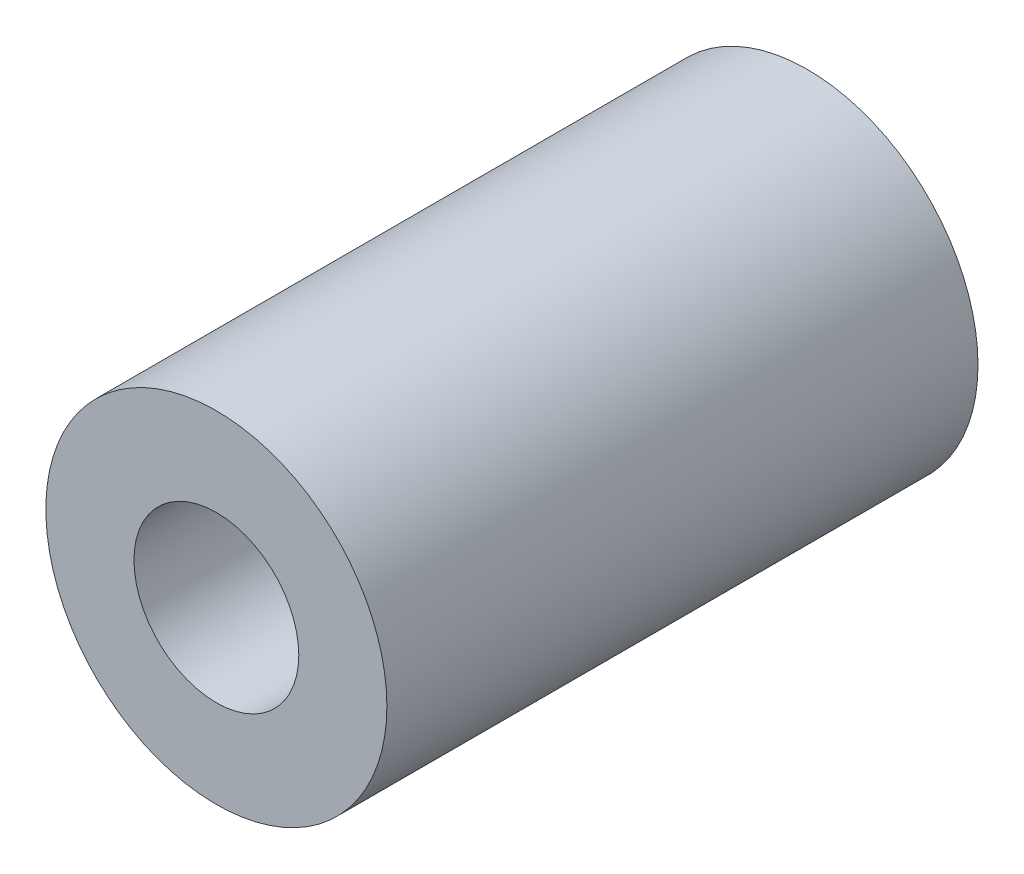
ISO-10303-21;
HEADER;
FILE_DESCRIPTION(('STEP AP214'),'2;1');
FILE_NAME('part.step','',(''),(''),'','','');
FILE_SCHEMA(('AUTOMOTIVE_DESIGN { 1 0 10303 214 1 1 1 1 }'));
ENDSEC;
DATA;
#1=APPLICATION_CONTEXT('core data for automotive mechanical design processes');
#2=APPLICATION_PROTOCOL_DEFINITION('international standard','automotive_design',2000,#1);
#3=PRODUCT_CONTEXT('',#1,'mechanical');
#4=PRODUCT('Part','Part','',(#3));
#5=PRODUCT_RELATED_PRODUCT_CATEGORY('part','',(#4));
#6=PRODUCT_DEFINITION_FORMATION('','',#4);
#7=PRODUCT_DEFINITION_CONTEXT('part definition',#1,'design');
#8=PRODUCT_DEFINITION('design','',#6,#7);
#9=PRODUCT_DEFINITION_SHAPE('','',#8);
#10=(LENGTH_UNIT() NAMED_UNIT(*) SI_UNIT(.MILLI.,.METRE.));
#11=(NAMED_UNIT(*) PLANE_ANGLE_UNIT() SI_UNIT($,.RADIAN.));
#12=(NAMED_UNIT(*) SI_UNIT($,.STERADIAN.) SOLID_ANGLE_UNIT());
#13=UNCERTAINTY_MEASURE_WITH_UNIT(LENGTH_MEASURE(1.E-05),#10,'distance_accuracy_value','');
#14=(GEOMETRIC_REPRESENTATION_CONTEXT(3) GLOBAL_UNCERTAINTY_ASSIGNED_CONTEXT((#13)) GLOBAL_UNIT_ASSIGNED_CONTEXT((#10,
#11,#12)) REPRESENTATION_CONTEXT('',''));
#15=CARTESIAN_POINT('',(0.,0.,0.));
#16=DIRECTION('',(0.,0.,1.));
#17=DIRECTION('',(1.,0.,0.));
#18=AXIS2_PLACEMENT_3D('',#15,#16,#17);
#19=CARTESIAN_POINT('',(0.,0.,0.));
#20=DIRECTION('',(0.,0.,1.));
#21=DIRECTION('',(1.,0.,0.));
#22=AXIS2_PLACEMENT_3D('',#19,#20,#21);
#23=CYLINDRICAL_SURFACE('',#22,14.5);
#24=CARTESIAN_POINT('',(0.,0.,0.));
#25=DIRECTION('',(0.,0.,1.));
#26=DIRECTION('',(1.,0.,0.));
#27=AXIS2_PLACEMENT_3D('',#24,#25,#26);
#28=CIRCLE('',#27,14.5);
#29=CARTESIAN_POINT('',(14.5,0.,0.));
#30=VERTEX_POINT('',#29);
#31=EDGE_CURVE('E37',#30,#30,#28,.T.);
#32=ORIENTED_EDGE('',*,*,#31,.F.);
#33=EDGE_LOOP('',(#32));
#34=FACE_BOUND('',#33,.T.);
#35=CARTESIAN_POINT('',(0.,0.,104.));
#36=DIRECTION('',(0.,0.,1.));
#37=DIRECTION('',(1.,0.,0.));
#38=AXIS2_PLACEMENT_3D('',#35,#36,#37);
#39=CIRCLE('',#38,14.5);
#40=CARTESIAN_POINT('',(14.5,0.,104.));
#41=VERTEX_POINT('',#40);
#42=EDGE_CURVE('E25',#41,#41,#39,.T.);
#43=ORIENTED_EDGE('',*,*,#42,.T.);
#44=EDGE_LOOP('',(#43));
#45=FACE_BOUND('',#44,.T.);
#46=ADVANCED_FACE('F22',(#34,#45),#23,.F.);
#47=CARTESIAN_POINT('',(0.,0.,104.));
#48=DIRECTION('',(0.,0.,-1.));
#49=DIRECTION('',(-1.,0.,0.));
#50=AXIS2_PLACEMENT_3D('',#47,#48,#49);
#51=PLANE('',#50);
#52=ORIENTED_EDGE('',*,*,#42,.F.);
#53=EDGE_LOOP('',(#52));
#54=FACE_BOUND('',#53,.T.);
#55=CARTESIAN_POINT('',(0.,0.,104.));
#56=DIRECTION('',(0.,0.,1.));
#57=DIRECTION('',(1.,0.,0.));
#58=AXIS2_PLACEMENT_3D('',#55,#56,#57);
#59=CIRCLE('',#58,30.);
#60=CARTESIAN_POINT('',(30.,0.,104.));
#61=VERTEX_POINT('',#60);
#62=EDGE_CURVE('E30',#61,#61,#59,.F.);
#63=ORIENTED_EDGE('',*,*,#62,.F.);
#64=EDGE_LOOP('',(#63));
#65=FACE_BOUND('',#64,.T.);
#66=ADVANCED_FACE('F48',(#54,#65),#51,.F.);
#67=CARTESIAN_POINT('',(0.,0.,0.));
#68=DIRECTION('',(0.,0.,-1.));
#69=DIRECTION('',(-1.,0.,0.));
#70=AXIS2_PLACEMENT_3D('',#67,#68,#69);
#71=PLANE('',#70);
#72=ORIENTED_EDGE('',*,*,#31,.T.);
#73=EDGE_LOOP('',(#72));
#74=FACE_BOUND('',#73,.T.);
#75=CARTESIAN_POINT('',(0.,0.,0.));
#76=DIRECTION('',(0.,0.,1.));
#77=DIRECTION('',(1.,0.,0.));
#78=AXIS2_PLACEMENT_3D('',#75,#76,#77);
#79=CIRCLE('',#78,30.);
#80=CARTESIAN_POINT('',(30.,0.,0.));
#81=VERTEX_POINT('',#80);
#82=EDGE_CURVE('E12',#81,#81,#79,.T.);
#83=ORIENTED_EDGE('',*,*,#82,.F.);
#84=EDGE_LOOP('',(#83));
#85=FACE_BOUND('',#84,.T.);
#86=ADVANCED_FACE('F51',(#74,#85),#71,.T.);
#87=CARTESIAN_POINT('',(0.,0.,0.));
#88=DIRECTION('',(0.,0.,1.));
#89=DIRECTION('',(1.,0.,0.));
#90=AXIS2_PLACEMENT_3D('',#87,#88,#89);
#91=CYLINDRICAL_SURFACE('',#90,30.);
#92=ORIENTED_EDGE('',*,*,#82,.T.);
#93=EDGE_LOOP('',(#92));
#94=FACE_BOUND('',#93,.T.);
#95=ORIENTED_EDGE('',*,*,#62,.T.);
#96=EDGE_LOOP('',(#95));
#97=FACE_BOUND('',#96,.T.);
#98=ADVANCED_FACE('F54',(#94,#97),#91,.T.);
#99=CLOSED_SHELL('',(#46,#66,#86,#98));
#100=MANIFOLD_SOLID_BREP('B1',#99);
#101=ADVANCED_BREP_SHAPE_REPRESENTATION('',(#18,#100),#14);
#102=SHAPE_DEFINITION_REPRESENTATION(#9,#101);
ENDSEC;
END-ISO-10303-21;
